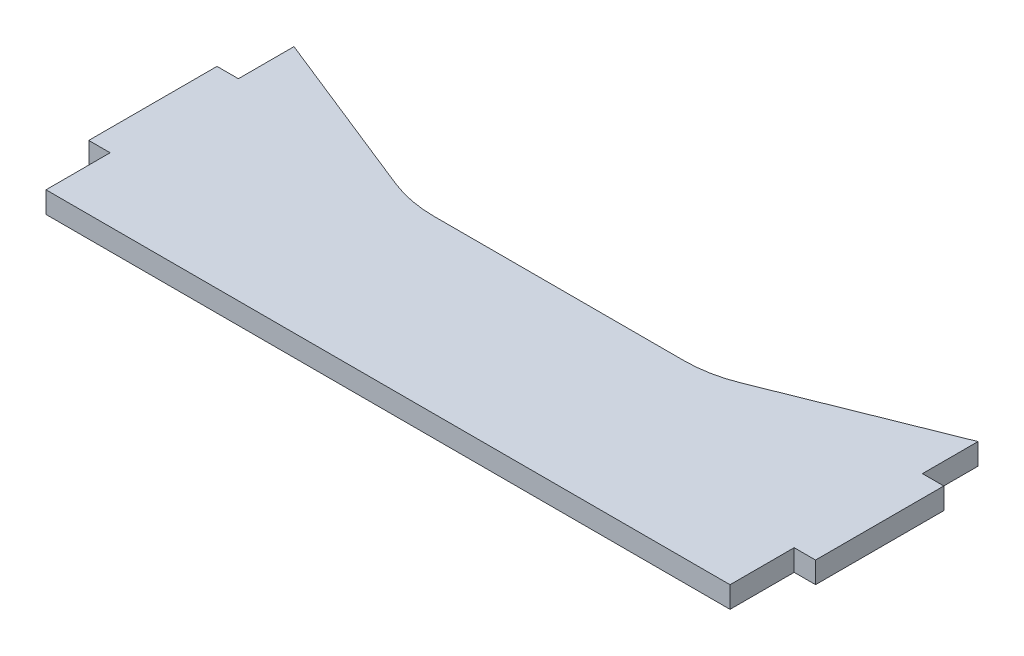
ISO-10303-21;
HEADER;
FILE_DESCRIPTION(('STEP AP214'),'2;1');
FILE_NAME('part.step','',(''),(''),'','','');
FILE_SCHEMA(('AUTOMOTIVE_DESIGN { 1 0 10303 214 1 1 1 1 }'));
ENDSEC;
DATA;
#1=APPLICATION_CONTEXT('core data for automotive mechanical design processes');
#2=APPLICATION_PROTOCOL_DEFINITION('international standard','automotive_design',2000,#1);
#3=PRODUCT_CONTEXT('',#1,'mechanical');
#4=PRODUCT('Part','Part','',(#3));
#5=PRODUCT_RELATED_PRODUCT_CATEGORY('part','',(#4));
#6=PRODUCT_DEFINITION_FORMATION('','',#4);
#7=PRODUCT_DEFINITION_CONTEXT('part definition',#1,'design');
#8=PRODUCT_DEFINITION('design','',#6,#7);
#9=PRODUCT_DEFINITION_SHAPE('','',#8);
#10=(LENGTH_UNIT() NAMED_UNIT(*) SI_UNIT(.MILLI.,.METRE.));
#11=(NAMED_UNIT(*) PLANE_ANGLE_UNIT() SI_UNIT($,.RADIAN.));
#12=(NAMED_UNIT(*) SI_UNIT($,.STERADIAN.) SOLID_ANGLE_UNIT());
#13=UNCERTAINTY_MEASURE_WITH_UNIT(LENGTH_MEASURE(1.E-05),#10,'distance_accuracy_value','');
#14=(GEOMETRIC_REPRESENTATION_CONTEXT(3) GLOBAL_UNCERTAINTY_ASSIGNED_CONTEXT((#13)) GLOBAL_UNIT_ASSIGNED_CONTEXT((#10,
#11,#12)) REPRESENTATION_CONTEXT('',''));
#15=CARTESIAN_POINT('',(0.,0.,0.));
#16=DIRECTION('',(0.,0.,1.));
#17=DIRECTION('',(1.,0.,0.));
#18=AXIS2_PLACEMENT_3D('',#15,#16,#17);
#19=CARTESIAN_POINT('',(0.,5.,-40.));
#20=DIRECTION('',(0.,0.,1.));
#21=DIRECTION('',(1.,0.,0.));
#22=AXIS2_PLACEMENT_3D('',#19,#20,#21);
#23=PLANE('',#22);
#24=DIRECTION('',(-1.,0.,0.));
#25=VECTOR('',#24,1.);
#26=CARTESIAN_POINT('',(0.,5.,-40.));
#27=LINE('',#26,#25);
#28=CARTESIAN_POINT('',(114.222527892982,5.,-40.));
#29=VERTEX_POINT('',#28);
#30=CARTESIAN_POINT('',(55.7774721070176,5.,-40.));
#31=VERTEX_POINT('',#30);
#32=EDGE_CURVE('E187',#29,#31,#27,.T.);
#33=ORIENTED_EDGE('',*,*,#32,.F.);
#34=DIRECTION('',(0.,1.,0.));
#35=VECTOR('',#34,1.);
#36=CARTESIAN_POINT('',(114.222527892982,5.,-40.));
#37=LINE('',#36,#35);
#38=CARTESIAN_POINT('',(114.222527892982,0.,-40.));
#39=VERTEX_POINT('',#38);
#40=EDGE_CURVE('E221',#29,#39,#37,.F.);
#41=ORIENTED_EDGE('',*,*,#40,.T.);
#42=DIRECTION('',(-1.,0.,0.));
#43=VECTOR('',#42,1.);
#44=CARTESIAN_POINT('',(0.,0.,-40.));
#45=LINE('',#44,#43);
#46=CARTESIAN_POINT('',(55.7774721070176,0.,-40.));
#47=VERTEX_POINT('',#46);
#48=EDGE_CURVE('E169',#39,#47,#45,.T.);
#49=ORIENTED_EDGE('',*,*,#48,.T.);
#50=DIRECTION('',(0.,1.,0.));
#51=VECTOR('',#50,1.);
#52=CARTESIAN_POINT('',(55.7774721070176,5.,-40.));
#53=LINE('',#52,#51);
#54=EDGE_CURVE('E191',#47,#31,#53,.T.);
#55=ORIENTED_EDGE('',*,*,#54,.T.);
#56=EDGE_LOOP('',(#33,#41,#49,#55));
#57=FACE_BOUND('',#56,.T.);
#58=ADVANCED_FACE('F35',(#57),#23,.F.);
#59=CARTESIAN_POINT('',(0.,5.,0.));
#60=DIRECTION('',(1.,0.,0.));
#61=DIRECTION('',(0.,0.,-1.));
#62=AXIS2_PLACEMENT_3D('',#59,#60,#61);
#63=PLANE('',#62);
#64=DIRECTION('',(0.,0.,1.));
#65=VECTOR('',#64,1.);
#66=CARTESIAN_POINT('',(0.,0.,0.));
#67=LINE('',#66,#65);
#68=CARTESIAN_POINT('',(0.,0.,-45.));
#69=VERTEX_POINT('',#68);
#70=CARTESIAN_POINT('',(0.,0.,-15.));
#71=VERTEX_POINT('',#70);
#72=EDGE_CURVE('E176',#69,#71,#67,.T.);
#73=ORIENTED_EDGE('',*,*,#72,.T.);
#74=DIRECTION('',(0.,-1.,0.));
#75=VECTOR('',#74,1.);
#76=CARTESIAN_POINT('',(0.,10.,-15.));
#77=LINE('',#76,#75);
#78=CARTESIAN_POINT('',(0.,5.,-15.));
#79=VERTEX_POINT('',#78);
#80=EDGE_CURVE('E385',#79,#71,#77,.T.);
#81=ORIENTED_EDGE('',*,*,#80,.F.);
#82=DIRECTION('',(0.,0.,1.));
#83=VECTOR('',#82,1.);
#84=CARTESIAN_POINT('',(0.,5.,0.));
#85=LINE('',#84,#83);
#86=CARTESIAN_POINT('',(0.,5.,-45.));
#87=VERTEX_POINT('',#86);
#88=EDGE_CURVE('E173',#87,#79,#85,.T.);
#89=ORIENTED_EDGE('',*,*,#88,.F.);
#90=DIRECTION('',(0.,-1.,0.));
#91=VECTOR('',#90,1.);
#92=CARTESIAN_POINT('',(0.,10.,-45.));
#93=LINE('',#92,#91);
#94=EDGE_CURVE('E406',#87,#69,#93,.T.);
#95=ORIENTED_EDGE('',*,*,#94,.T.);
#96=EDGE_LOOP('',(#73,#81,#89,#95));
#97=FACE_BOUND('',#96,.T.);
#98=ADVANCED_FACE('F240',(#97),#63,.F.);
#99=CARTESIAN_POINT('',(0.,5.,0.));
#100=DIRECTION('',(0.,0.,-1.));
#101=DIRECTION('',(-1.,0.,0.));
#102=AXIS2_PLACEMENT_3D('',#99,#100,#101);
#103=PLANE('',#102);
#104=DIRECTION('',(1.,0.,0.));
#105=VECTOR('',#104,1.);
#106=CARTESIAN_POINT('',(0.,0.,0.));
#107=LINE('',#106,#105);
#108=CARTESIAN_POINT('',(4.99999999999999,0.,0.));
#109=VERTEX_POINT('',#108);
#110=CARTESIAN_POINT('',(165.,0.,0.));
#111=VERTEX_POINT('',#110);
#112=EDGE_CURVE('E170',#109,#111,#107,.T.);
#113=ORIENTED_EDGE('',*,*,#112,.T.);
#114=DIRECTION('',(0.,-1.,0.));
#115=VECTOR('',#114,1.);
#116=CARTESIAN_POINT('',(165.,10.,0.));
#117=LINE('',#116,#115);
#118=CARTESIAN_POINT('',(165.,5.,0.));
#119=VERTEX_POINT('',#118);
#120=EDGE_CURVE('E163',#119,#111,#117,.T.);
#121=ORIENTED_EDGE('',*,*,#120,.F.);
#122=DIRECTION('',(1.,0.,0.));
#123=VECTOR('',#122,1.);
#124=CARTESIAN_POINT('',(0.,5.,0.));
#125=LINE('',#124,#123);
#126=CARTESIAN_POINT('',(4.99999999999999,5.,0.));
#127=VERTEX_POINT('',#126);
#128=EDGE_CURVE('E383',#127,#119,#125,.T.);
#129=ORIENTED_EDGE('',*,*,#128,.F.);
#130=DIRECTION('',(0.,-1.,0.));
#131=VECTOR('',#130,1.);
#132=CARTESIAN_POINT('',(4.99999999999999,10.,0.));
#133=LINE('',#132,#131);
#134=EDGE_CURVE('E382',#127,#109,#133,.T.);
#135=ORIENTED_EDGE('',*,*,#134,.T.);
#136=EDGE_LOOP('',(#113,#121,#129,#135));
#137=FACE_BOUND('',#136,.T.);
#138=ADVANCED_FACE('F246',(#137),#103,.F.);
#139=CARTESIAN_POINT('',(170.,5.,0.));
#140=DIRECTION('',(-1.,0.,0.));
#141=DIRECTION('',(0.,0.,1.));
#142=AXIS2_PLACEMENT_3D('',#139,#140,#141);
#143=PLANE('',#142);
#144=DIRECTION('',(0.,0.,-1.));
#145=VECTOR('',#144,1.);
#146=CARTESIAN_POINT('',(170.,5.,0.));
#147=LINE('',#146,#145);
#148=CARTESIAN_POINT('',(170.,5.,-15.));
#149=VERTEX_POINT('',#148);
#150=CARTESIAN_POINT('',(170.,5.,-45.));
#151=VERTEX_POINT('',#150);
#152=EDGE_CURVE('E162',#149,#151,#147,.T.);
#153=ORIENTED_EDGE('',*,*,#152,.F.);
#154=DIRECTION('',(0.,-1.,0.));
#155=VECTOR('',#154,1.);
#156=CARTESIAN_POINT('',(170.,10.,-15.));
#157=LINE('',#156,#155);
#158=CARTESIAN_POINT('',(170.,0.,-15.));
#159=VERTEX_POINT('',#158);
#160=EDGE_CURVE('E150',#149,#159,#157,.T.);
#161=ORIENTED_EDGE('',*,*,#160,.T.);
#162=DIRECTION('',(0.,0.,-1.));
#163=VECTOR('',#162,1.);
#164=CARTESIAN_POINT('',(170.,0.,0.));
#165=LINE('',#164,#163);
#166=CARTESIAN_POINT('',(170.,0.,-45.));
#167=VERTEX_POINT('',#166);
#168=EDGE_CURVE('E160',#159,#167,#165,.T.);
#169=ORIENTED_EDGE('',*,*,#168,.T.);
#170=DIRECTION('',(0.,-1.,0.));
#171=VECTOR('',#170,1.);
#172=CARTESIAN_POINT('',(170.,10.,-45.));
#173=LINE('',#172,#171);
#174=EDGE_CURVE('E425',#151,#167,#173,.T.);
#175=ORIENTED_EDGE('',*,*,#174,.F.);
#176=EDGE_LOOP('',(#153,#161,#169,#175));
#177=FACE_BOUND('',#176,.T.);
#178=ADVANCED_FACE('F158',(#177),#143,.F.);
#179=CARTESIAN_POINT('',(0.,5.,0.));
#180=DIRECTION('',(0.,-1.,0.));
#181=DIRECTION('',(0.,0.,-1.));
#182=AXIS2_PLACEMENT_3D('',#179,#180,#181);
#183=PLANE('',#182);
#184=ORIENTED_EDGE('',*,*,#128,.T.);
#185=DIRECTION('',(0.,0.,-1.));
#186=VECTOR('',#185,1.);
#187=CARTESIAN_POINT('',(165.,5.,0.));
#188=LINE('',#187,#186);
#189=CARTESIAN_POINT('',(165.,5.,-15.));
#190=VERTEX_POINT('',#189);
#191=EDGE_CURVE('E374',#119,#190,#188,.T.);
#192=ORIENTED_EDGE('',*,*,#191,.T.);
#193=DIRECTION('',(1.,0.,0.));
#194=VECTOR('',#193,1.);
#195=CARTESIAN_POINT('',(0.,5.,-15.));
#196=LINE('',#195,#194);
#197=EDGE_CURVE('E376',#190,#149,#196,.T.);
#198=ORIENTED_EDGE('',*,*,#197,.T.);
#199=ORIENTED_EDGE('',*,*,#152,.T.);
#200=DIRECTION('',(-1.,0.,0.));
#201=VECTOR('',#200,1.);
#202=CARTESIAN_POINT('',(0.,5.,-45.));
#203=LINE('',#202,#201);
#204=CARTESIAN_POINT('',(165.,5.,-45.));
#205=VERTEX_POINT('',#204);
#206=EDGE_CURVE('E423',#151,#205,#203,.T.);
#207=ORIENTED_EDGE('',*,*,#206,.T.);
#208=DIRECTION('',(0.,0.,-1.));
#209=VECTOR('',#208,1.);
#210=CARTESIAN_POINT('',(165.,5.,0.));
#211=LINE('',#210,#209);
#212=CARTESIAN_POINT('',(165.,5.,-58.));
#213=VERTEX_POINT('',#212);
#214=EDGE_CURVE('E427',#205,#213,#211,.T.);
#215=ORIENTED_EDGE('',*,*,#214,.T.);
#216=DIRECTION('',(-0.928476690885259,0.,0.371390676354104));
#217=VECTOR('',#216,1.);
#218=CARTESIAN_POINT('',(170.,5.,-60.));
#219=LINE('',#218,#217);
#220=CARTESIAN_POINT('',(125.364248183606,5.,-42.1456992734422));
#221=VERTEX_POINT('',#220);
#222=EDGE_CURVE('E202',#213,#221,#219,.T.);
#223=ORIENTED_EDGE('',*,*,#222,.T.);
#224=CARTESIAN_POINT('',(114.222527892982,5.,-70.));
#225=DIRECTION('',(0.,-1.,0.));
#226=DIRECTION('',(0.,0.,-1.));
#227=AXIS2_PLACEMENT_3D('',#224,#225,#226);
#228=CIRCLE('',#227,30.);
#229=EDGE_CURVE('E218',#221,#29,#228,.T.);
#230=ORIENTED_EDGE('',*,*,#229,.T.);
#231=ORIENTED_EDGE('',*,*,#32,.T.);
#232=CARTESIAN_POINT('',(55.7774721070176,5.,-70.));
#233=DIRECTION('',(0.,-1.,0.));
#234=DIRECTION('',(0.,0.,-1.));
#235=AXIS2_PLACEMENT_3D('',#232,#233,#234);
#236=CIRCLE('',#235,30.);
#237=CARTESIAN_POINT('',(44.6357518163945,5.,-42.1456992734422));
#238=VERTEX_POINT('',#237);
#239=EDGE_CURVE('E214',#31,#238,#236,.T.);
#240=ORIENTED_EDGE('',*,*,#239,.T.);
#241=DIRECTION('',(-0.928476690885259,0.,-0.371390676354104));
#242=VECTOR('',#241,1.);
#243=CARTESIAN_POINT('',(0.,5.,-60.));
#244=LINE('',#243,#242);
#245=CARTESIAN_POINT('',(4.99999999999999,5.,-58.));
#246=VERTEX_POINT('',#245);
#247=EDGE_CURVE('E415',#238,#246,#244,.T.);
#248=ORIENTED_EDGE('',*,*,#247,.T.);
#249=DIRECTION('',(0.,0.,1.));
#250=VECTOR('',#249,1.);
#251=CARTESIAN_POINT('',(4.99999999999999,5.,0.));
#252=LINE('',#251,#250);
#253=CARTESIAN_POINT('',(4.99999999999999,5.,-45.));
#254=VERTEX_POINT('',#253);
#255=EDGE_CURVE('E408',#246,#254,#252,.T.);
#256=ORIENTED_EDGE('',*,*,#255,.T.);
#257=DIRECTION('',(-1.,0.,0.));
#258=VECTOR('',#257,1.);
#259=CARTESIAN_POINT('',(0.,5.,-45.));
#260=LINE('',#259,#258);
#261=EDGE_CURVE('E412',#254,#87,#260,.T.);
#262=ORIENTED_EDGE('',*,*,#261,.T.);
#263=ORIENTED_EDGE('',*,*,#88,.T.);
#264=DIRECTION('',(1.,0.,0.));
#265=VECTOR('',#264,1.);
#266=CARTESIAN_POINT('',(0.,5.,-15.));
#267=LINE('',#266,#265);
#268=CARTESIAN_POINT('',(4.99999999999999,5.,-15.));
#269=VERTEX_POINT('',#268);
#270=EDGE_CURVE('E395',#79,#269,#267,.T.);
#271=ORIENTED_EDGE('',*,*,#270,.T.);
#272=DIRECTION('',(0.,0.,1.));
#273=VECTOR('',#272,1.);
#274=CARTESIAN_POINT('',(4.99999999999999,5.,0.));
#275=LINE('',#274,#273);
#276=EDGE_CURVE('E398',#269,#127,#275,.T.);
#277=ORIENTED_EDGE('',*,*,#276,.T.);
#278=EDGE_LOOP('',(#184,#192,#198,#199,#207,#215,#223,#230,#231,#240,#248,#256,#262,#263,#271,#277));
#279=FACE_BOUND('',#278,.T.);
#280=ADVANCED_FACE('F237',(#279),#183,.F.);
#281=CARTESIAN_POINT('',(0.,0.,0.));
#282=DIRECTION('',(0.,-1.,0.));
#283=DIRECTION('',(0.,0.,-1.));
#284=AXIS2_PLACEMENT_3D('',#281,#282,#283);
#285=PLANE('',#284);
#286=DIRECTION('',(0.,0.,-1.));
#287=VECTOR('',#286,1.);
#288=CARTESIAN_POINT('',(165.,0.,-15.));
#289=LINE('',#288,#287);
#290=CARTESIAN_POINT('',(165.,0.,-15.));
#291=VERTEX_POINT('',#290);
#292=EDGE_CURVE('E50',#111,#291,#289,.T.);
#293=ORIENTED_EDGE('',*,*,#292,.F.);
#294=ORIENTED_EDGE('',*,*,#112,.F.);
#295=DIRECTION('',(0.,0.,1.));
#296=VECTOR('',#295,1.);
#297=CARTESIAN_POINT('',(4.99999999999999,0.,-15.));
#298=LINE('',#297,#296);
#299=CARTESIAN_POINT('',(4.99999999999999,0.,-15.));
#300=VERTEX_POINT('',#299);
#301=EDGE_CURVE('E391',#300,#109,#298,.T.);
#302=ORIENTED_EDGE('',*,*,#301,.F.);
#303=DIRECTION('',(1.,0.,0.));
#304=VECTOR('',#303,1.);
#305=CARTESIAN_POINT('',(4.99999999999999,0.,-15.));
#306=LINE('',#305,#304);
#307=EDGE_CURVE('E386',#71,#300,#306,.T.);
#308=ORIENTED_EDGE('',*,*,#307,.F.);
#309=ORIENTED_EDGE('',*,*,#72,.F.);
#310=DIRECTION('',(-1.,0.,0.));
#311=VECTOR('',#310,1.);
#312=CARTESIAN_POINT('',(4.99999999999999,0.,-45.));
#313=LINE('',#312,#311);
#314=CARTESIAN_POINT('',(4.99999999999999,0.,-45.));
#315=VERTEX_POINT('',#314);
#316=EDGE_CURVE('E403',#315,#69,#313,.T.);
#317=ORIENTED_EDGE('',*,*,#316,.F.);
#318=DIRECTION('',(0.,0.,1.));
#319=VECTOR('',#318,1.);
#320=CARTESIAN_POINT('',(4.99999999999999,0.,-45.));
#321=LINE('',#320,#319);
#322=CARTESIAN_POINT('',(4.99999999999999,0.,-58.));
#323=VERTEX_POINT('',#322);
#324=EDGE_CURVE('E400',#323,#315,#321,.T.);
#325=ORIENTED_EDGE('',*,*,#324,.F.);
#326=DIRECTION('',(-0.928476690885259,0.,-0.371390676354104));
#327=VECTOR('',#326,1.);
#328=CARTESIAN_POINT('',(0.,0.,-60.));
#329=LINE('',#328,#327);
#330=CARTESIAN_POINT('',(44.6357518163945,0.,-42.1456992734422));
#331=VERTEX_POINT('',#330);
#332=EDGE_CURVE('E208',#331,#323,#329,.T.);
#333=ORIENTED_EDGE('',*,*,#332,.F.);
#334=CARTESIAN_POINT('',(55.7774721070176,0.,-70.));
#335=DIRECTION('',(0.,-1.,0.));
#336=DIRECTION('',(0.,0.,-1.));
#337=AXIS2_PLACEMENT_3D('',#334,#335,#336);
#338=CIRCLE('',#337,30.);
#339=EDGE_CURVE('E212',#331,#47,#338,.F.);
#340=ORIENTED_EDGE('',*,*,#339,.T.);
#341=ORIENTED_EDGE('',*,*,#48,.F.);
#342=CARTESIAN_POINT('',(114.222527892982,0.,-70.));
#343=DIRECTION('',(0.,-1.,0.));
#344=DIRECTION('',(0.,0.,-1.));
#345=AXIS2_PLACEMENT_3D('',#342,#343,#344);
#346=CIRCLE('',#345,30.);
#347=CARTESIAN_POINT('',(125.364248183606,0.,-42.1456992734422));
#348=VERTEX_POINT('',#347);
#349=EDGE_CURVE('E216',#39,#348,#346,.F.);
#350=ORIENTED_EDGE('',*,*,#349,.T.);
#351=DIRECTION('',(-0.928476690885259,0.,0.371390676354104));
#352=VECTOR('',#351,1.);
#353=CARTESIAN_POINT('',(170.,0.,-60.));
#354=LINE('',#353,#352);
#355=CARTESIAN_POINT('',(165.,0.,-58.));
#356=VERTEX_POINT('',#355);
#357=EDGE_CURVE('E197',#356,#348,#354,.T.);
#358=ORIENTED_EDGE('',*,*,#357,.F.);
#359=DIRECTION('',(0.,0.,-1.));
#360=VECTOR('',#359,1.);
#361=CARTESIAN_POINT('',(165.,0.,-45.));
#362=LINE('',#361,#360);
#363=CARTESIAN_POINT('',(165.,0.,-45.));
#364=VERTEX_POINT('',#363);
#365=EDGE_CURVE('E57',#364,#356,#362,.T.);
#366=ORIENTED_EDGE('',*,*,#365,.F.);
#367=DIRECTION('',(-1.,0.,0.));
#368=VECTOR('',#367,1.);
#369=CARTESIAN_POINT('',(165.,0.,-45.));
#370=LINE('',#369,#368);
#371=EDGE_CURVE('E168',#167,#364,#370,.T.);
#372=ORIENTED_EDGE('',*,*,#371,.F.);
#373=ORIENTED_EDGE('',*,*,#168,.F.);
#374=DIRECTION('',(1.,0.,0.));
#375=VECTOR('',#374,1.);
#376=CARTESIAN_POINT('',(165.,0.,-15.));
#377=LINE('',#376,#375);
#378=EDGE_CURVE('E147',#291,#159,#377,.T.);
#379=ORIENTED_EDGE('',*,*,#378,.F.);
#380=EDGE_LOOP('',(#293,#294,#302,#308,#309,#317,#325,#333,#340,#341,#350,#358,#366,#372,#373,#379));
#381=FACE_BOUND('',#380,.T.);
#382=ADVANCED_FACE('F166',(#381),#285,.T.);
#383=CARTESIAN_POINT('',(170.,0.,-60.));
#384=DIRECTION('',(-0.371390676354104,0.,-0.928476690885259));
#385=DIRECTION('',(-0.928476690885259,0.,0.371390676354104));
#386=AXIS2_PLACEMENT_3D('',#383,#384,#385);
#387=PLANE('',#386);
#388=DIRECTION('',(0.,1.,0.));
#389=VECTOR('',#388,1.);
#390=CARTESIAN_POINT('',(165.,0.,-58.));
#391=LINE('',#390,#389);
#392=EDGE_CURVE('E12',#356,#213,#391,.T.);
#393=ORIENTED_EDGE('',*,*,#392,.F.);
#394=ORIENTED_EDGE('',*,*,#357,.T.);
#395=DIRECTION('',(0.,1.,0.));
#396=VECTOR('',#395,1.);
#397=CARTESIAN_POINT('',(125.364248183606,0.,-42.1456992734422));
#398=LINE('',#397,#396);
#399=EDGE_CURVE('E186',#348,#221,#398,.T.);
#400=ORIENTED_EDGE('',*,*,#399,.T.);
#401=ORIENTED_EDGE('',*,*,#222,.F.);
#402=EDGE_LOOP('',(#393,#394,#400,#401));
#403=FACE_BOUND('',#402,.T.);
#404=ADVANCED_FACE('F230',(#403),#387,.T.);
#405=CARTESIAN_POINT('',(0.,0.,-60.));
#406=DIRECTION('',(0.371390676354104,0.,-0.928476690885259));
#407=DIRECTION('',(-0.928476690885259,0.,-0.371390676354104));
#408=AXIS2_PLACEMENT_3D('',#405,#406,#407);
#409=PLANE('',#408);
#410=DIRECTION('',(0.,-1.,0.));
#411=VECTOR('',#410,1.);
#412=CARTESIAN_POINT('',(4.99999999999999,0.,-58.));
#413=LINE('',#412,#411);
#414=EDGE_CURVE('E43',#246,#323,#413,.T.);
#415=ORIENTED_EDGE('',*,*,#414,.F.);
#416=ORIENTED_EDGE('',*,*,#247,.F.);
#417=DIRECTION('',(0.,1.,0.));
#418=VECTOR('',#417,1.);
#419=CARTESIAN_POINT('',(44.6357518163945,0.,-42.1456992734422));
#420=LINE('',#419,#418);
#421=EDGE_CURVE('E220',#238,#331,#420,.F.);
#422=ORIENTED_EDGE('',*,*,#421,.T.);
#423=ORIENTED_EDGE('',*,*,#332,.T.);
#424=EDGE_LOOP('',(#415,#416,#422,#423));
#425=FACE_BOUND('',#424,.T.);
#426=ADVANCED_FACE('F256',(#425),#409,.T.);
#427=CARTESIAN_POINT('',(114.222527892982,0.,-70.));
#428=DIRECTION('',(0.,1.,0.));
#429=DIRECTION('',(0.,0.,1.));
#430=AXIS2_PLACEMENT_3D('',#427,#428,#429);
#431=CYLINDRICAL_SURFACE('',#430,30.);
#432=ORIENTED_EDGE('',*,*,#349,.F.);
#433=ORIENTED_EDGE('',*,*,#40,.F.);
#434=ORIENTED_EDGE('',*,*,#229,.F.);
#435=ORIENTED_EDGE('',*,*,#399,.F.);
#436=EDGE_LOOP('',(#432,#433,#434,#435));
#437=FACE_BOUND('',#436,.T.);
#438=ADVANCED_FACE('F234',(#437),#431,.F.);
#439=CARTESIAN_POINT('',(55.7774721070176,5.,-70.));
#440=DIRECTION('',(0.,1.,0.));
#441=DIRECTION('',(0.,0.,1.));
#442=AXIS2_PLACEMENT_3D('',#439,#440,#441);
#443=CYLINDRICAL_SURFACE('',#442,30.);
#444=ORIENTED_EDGE('',*,*,#339,.F.);
#445=ORIENTED_EDGE('',*,*,#421,.F.);
#446=ORIENTED_EDGE('',*,*,#239,.F.);
#447=ORIENTED_EDGE('',*,*,#54,.F.);
#448=EDGE_LOOP('',(#444,#445,#446,#447));
#449=FACE_BOUND('',#448,.T.);
#450=ADVANCED_FACE('F37',(#449),#443,.F.);
#451=CARTESIAN_POINT('',(4.99999999999999,10.,-45.));
#452=DIRECTION('',(0.,0.,1.));
#453=DIRECTION('',(1.,0.,0.));
#454=AXIS2_PLACEMENT_3D('',#451,#452,#453);
#455=PLANE('',#454);
#456=DIRECTION('',(0.,-1.,0.));
#457=VECTOR('',#456,1.);
#458=CARTESIAN_POINT('',(4.99999999999999,10.,-45.));
#459=LINE('',#458,#457);
#460=EDGE_CURVE('E405',#254,#315,#459,.T.);
#461=ORIENTED_EDGE('',*,*,#460,.T.);
#462=ORIENTED_EDGE('',*,*,#316,.T.);
#463=ORIENTED_EDGE('',*,*,#94,.F.);
#464=ORIENTED_EDGE('',*,*,#261,.F.);
#465=EDGE_LOOP('',(#461,#462,#463,#464));
#466=FACE_BOUND('',#465,.T.);
#467=ADVANCED_FACE('F260',(#466),#455,.F.);
#468=CARTESIAN_POINT('',(4.99999999999999,10.,-45.));
#469=DIRECTION('',(1.,0.,0.));
#470=DIRECTION('',(0.,0.,-1.));
#471=AXIS2_PLACEMENT_3D('',#468,#469,#470);
#472=PLANE('',#471);
#473=ORIENTED_EDGE('',*,*,#414,.T.);
#474=ORIENTED_EDGE('',*,*,#324,.T.);
#475=ORIENTED_EDGE('',*,*,#460,.F.);
#476=ORIENTED_EDGE('',*,*,#255,.F.);
#477=EDGE_LOOP('',(#473,#474,#475,#476));
#478=FACE_BOUND('',#477,.T.);
#479=ADVANCED_FACE('F271',(#478),#472,.F.);
#480=CARTESIAN_POINT('',(4.99999999999999,10.,-15.));
#481=DIRECTION('',(1.,0.,0.));
#482=DIRECTION('',(0.,0.,-1.));
#483=AXIS2_PLACEMENT_3D('',#480,#481,#482);
#484=PLANE('',#483);
#485=DIRECTION('',(0.,-1.,0.));
#486=VECTOR('',#485,1.);
#487=CARTESIAN_POINT('',(4.99999999999999,10.,-15.));
#488=LINE('',#487,#486);
#489=EDGE_CURVE('E388',#269,#300,#488,.T.);
#490=ORIENTED_EDGE('',*,*,#489,.T.);
#491=ORIENTED_EDGE('',*,*,#301,.T.);
#492=ORIENTED_EDGE('',*,*,#134,.F.);
#493=ORIENTED_EDGE('',*,*,#276,.F.);
#494=EDGE_LOOP('',(#490,#491,#492,#493));
#495=FACE_BOUND('',#494,.T.);
#496=ADVANCED_FACE('F312',(#495),#484,.F.);
#497=CARTESIAN_POINT('',(4.99999999999999,10.,-15.));
#498=DIRECTION('',(0.,0.,-1.));
#499=DIRECTION('',(-1.,0.,0.));
#500=AXIS2_PLACEMENT_3D('',#497,#498,#499);
#501=PLANE('',#500);
#502=ORIENTED_EDGE('',*,*,#80,.T.);
#503=ORIENTED_EDGE('',*,*,#307,.T.);
#504=ORIENTED_EDGE('',*,*,#489,.F.);
#505=ORIENTED_EDGE('',*,*,#270,.F.);
#506=EDGE_LOOP('',(#502,#503,#504,#505));
#507=FACE_BOUND('',#506,.T.);
#508=ADVANCED_FACE('F320',(#507),#501,.F.);
#509=CARTESIAN_POINT('',(165.,10.,-45.));
#510=DIRECTION('',(0.,0.,1.));
#511=DIRECTION('',(1.,0.,0.));
#512=AXIS2_PLACEMENT_3D('',#509,#510,#511);
#513=PLANE('',#512);
#514=ORIENTED_EDGE('',*,*,#174,.T.);
#515=ORIENTED_EDGE('',*,*,#371,.T.);
#516=DIRECTION('',(0.,-1.,0.));
#517=VECTOR('',#516,1.);
#518=CARTESIAN_POINT('',(165.,10.,-45.));
#519=LINE('',#518,#517);
#520=EDGE_CURVE('E426',#205,#364,#519,.T.);
#521=ORIENTED_EDGE('',*,*,#520,.F.);
#522=ORIENTED_EDGE('',*,*,#206,.F.);
#523=EDGE_LOOP('',(#514,#515,#521,#522));
#524=FACE_BOUND('',#523,.T.);
#525=ADVANCED_FACE('F329',(#524),#513,.F.);
#526=CARTESIAN_POINT('',(165.,10.,-45.));
#527=DIRECTION('',(-1.,0.,0.));
#528=DIRECTION('',(0.,0.,1.));
#529=AXIS2_PLACEMENT_3D('',#526,#527,#528);
#530=PLANE('',#529);
#531=ORIENTED_EDGE('',*,*,#520,.T.);
#532=ORIENTED_EDGE('',*,*,#365,.T.);
#533=ORIENTED_EDGE('',*,*,#392,.T.);
#534=ORIENTED_EDGE('',*,*,#214,.F.);
#535=EDGE_LOOP('',(#531,#532,#533,#534));
#536=FACE_BOUND('',#535,.T.);
#537=ADVANCED_FACE('F338',(#536),#530,.F.);
#538=CARTESIAN_POINT('',(165.,10.,-15.));
#539=DIRECTION('',(-1.,0.,0.));
#540=DIRECTION('',(0.,0.,1.));
#541=AXIS2_PLACEMENT_3D('',#538,#539,#540);
#542=PLANE('',#541);
#543=ORIENTED_EDGE('',*,*,#120,.T.);
#544=ORIENTED_EDGE('',*,*,#292,.T.);
#545=DIRECTION('',(0.,-1.,0.));
#546=VECTOR('',#545,1.);
#547=CARTESIAN_POINT('',(165.,10.,-15.));
#548=LINE('',#547,#546);
#549=EDGE_CURVE('E152',#190,#291,#548,.T.);
#550=ORIENTED_EDGE('',*,*,#549,.F.);
#551=ORIENTED_EDGE('',*,*,#191,.F.);
#552=EDGE_LOOP('',(#543,#544,#550,#551));
#553=FACE_BOUND('',#552,.T.);
#554=ADVANCED_FACE('F347',(#553),#542,.F.);
#555=CARTESIAN_POINT('',(165.,10.,-15.));
#556=DIRECTION('',(0.,0.,-1.));
#557=DIRECTION('',(-1.,0.,0.));
#558=AXIS2_PLACEMENT_3D('',#555,#556,#557);
#559=PLANE('',#558);
#560=ORIENTED_EDGE('',*,*,#549,.T.);
#561=ORIENTED_EDGE('',*,*,#378,.T.);
#562=ORIENTED_EDGE('',*,*,#160,.F.);
#563=ORIENTED_EDGE('',*,*,#197,.F.);
#564=EDGE_LOOP('',(#560,#561,#562,#563));
#565=FACE_BOUND('',#564,.T.);
#566=ADVANCED_FACE('F149',(#565),#559,.F.);
#567=CLOSED_SHELL('',(#58,#98,#138,#178,#280,#382,#404,#426,#438,#450,#467,#479,#496,#508,#525,
#537,#554,#566));
#568=MANIFOLD_SOLID_BREP('B2',#567);
#569=ADVANCED_BREP_SHAPE_REPRESENTATION('',(#18,#568),#14);
#570=SHAPE_DEFINITION_REPRESENTATION(#9,#569);
ENDSEC;
END-ISO-10303-21;
